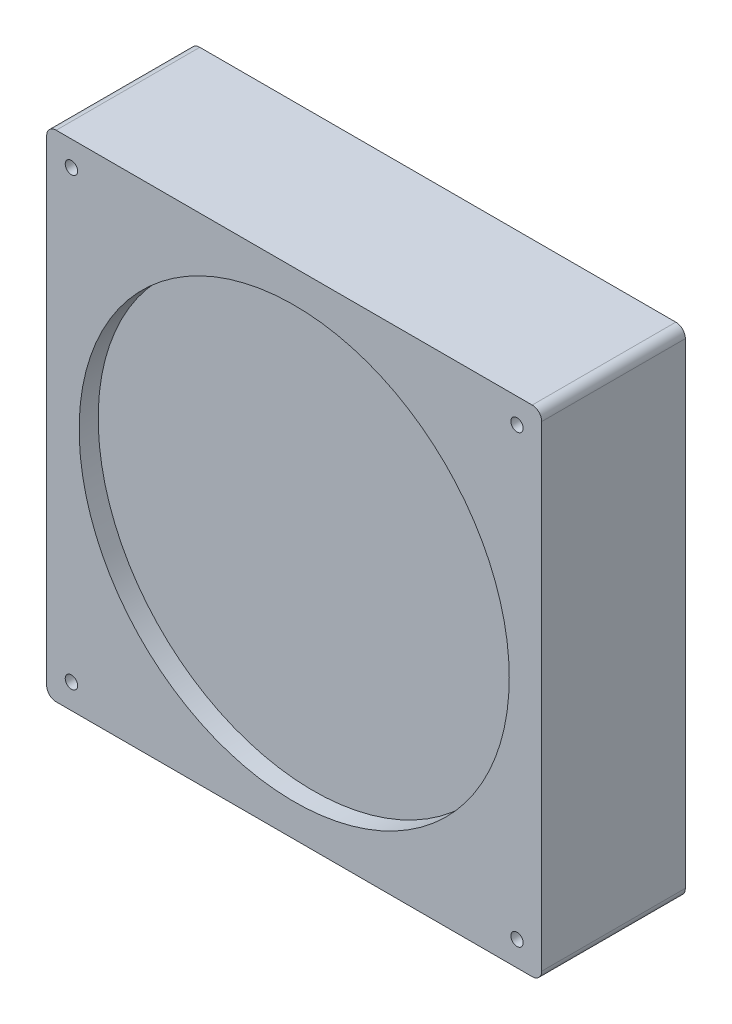
ISO-10303-21;
HEADER;
FILE_DESCRIPTION(('STEP AP214'),'2;1');
FILE_NAME('part.step','',(''),(''),'','','');
FILE_SCHEMA(('AUTOMOTIVE_DESIGN { 1 0 10303 214 1 1 1 1 }'));
ENDSEC;
DATA;
#1=APPLICATION_CONTEXT('core data for automotive mechanical design processes');
#2=APPLICATION_PROTOCOL_DEFINITION('international standard','automotive_design',2000,#1);
#3=PRODUCT_CONTEXT('',#1,'mechanical');
#4=PRODUCT('Part','Part','',(#3));
#5=PRODUCT_RELATED_PRODUCT_CATEGORY('part','',(#4));
#6=PRODUCT_DEFINITION_FORMATION('','',#4);
#7=PRODUCT_DEFINITION_CONTEXT('part definition',#1,'design');
#8=PRODUCT_DEFINITION('design','',#6,#7);
#9=PRODUCT_DEFINITION_SHAPE('','',#8);
#10=(LENGTH_UNIT() NAMED_UNIT(*) SI_UNIT(.MILLI.,.METRE.));
#11=(NAMED_UNIT(*) PLANE_ANGLE_UNIT() SI_UNIT($,.RADIAN.));
#12=(NAMED_UNIT(*) SI_UNIT($,.STERADIAN.) SOLID_ANGLE_UNIT());
#13=UNCERTAINTY_MEASURE_WITH_UNIT(LENGTH_MEASURE(1.E-05),#10,'distance_accuracy_value','');
#14=(GEOMETRIC_REPRESENTATION_CONTEXT(3) GLOBAL_UNCERTAINTY_ASSIGNED_CONTEXT((#13)) GLOBAL_UNIT_ASSIGNED_CONTEXT((#10,
#11,#12)) REPRESENTATION_CONTEXT('',''));
#15=CARTESIAN_POINT('',(0.,0.,0.));
#16=DIRECTION('',(0.,0.,1.));
#17=DIRECTION('',(1.,0.,0.));
#18=AXIS2_PLACEMENT_3D('',#15,#16,#17);
#19=CARTESIAN_POINT('',(66.0000000000017,66.0000000000007,38.29));
#20=DIRECTION('',(-1.00000000000001,0.,0.));
#21=DIRECTION('',(0.,0.,1.));
#22=AXIS2_PLACEMENT_3D('',#19,#20,#21);
#23=PLANE('',#22);
#24=DIRECTION('',(0.,1.00000000000001,0.));
#25=VECTOR('',#24,1.);
#26=CARTESIAN_POINT('',(66.0000000000017,66.0000000000007,38.29));
#27=LINE('',#26,#25);
#28=CARTESIAN_POINT('',(66.0000000000017,-63.4600000000009,38.29));
#29=VERTEX_POINT('',#28);
#30=CARTESIAN_POINT('',(66.0000000000017,63.4600000000007,38.29));
#31=VERTEX_POINT('',#30);
#32=EDGE_CURVE('E130',#29,#31,#27,.T.);
#33=ORIENTED_EDGE('',*,*,#32,.F.);
#34=DIRECTION('',(0.,0.,-1.));
#35=VECTOR('',#34,1.);
#36=CARTESIAN_POINT('',(66.0000000000017,-63.4600000000009,38.29));
#37=LINE('',#36,#35);
#38=CARTESIAN_POINT('',(66.0000000000017,-63.4600000000009,0.));
#39=VERTEX_POINT('',#38);
#40=EDGE_CURVE('E114',#29,#39,#37,.T.);
#41=ORIENTED_EDGE('',*,*,#40,.T.);
#42=DIRECTION('',(0.,1.00000000000001,0.));
#43=VECTOR('',#42,1.);
#44=CARTESIAN_POINT('',(66.0000000000017,66.0000000000007,0.));
#45=LINE('',#44,#43);
#46=CARTESIAN_POINT('',(66.0000000000017,63.4600000000007,0.));
#47=VERTEX_POINT('',#46);
#48=EDGE_CURVE('E127',#39,#47,#45,.T.);
#49=ORIENTED_EDGE('',*,*,#48,.T.);
#50=DIRECTION('',(0.,0.,-1.));
#51=VECTOR('',#50,1.);
#52=CARTESIAN_POINT('',(66.0000000000017,63.4600000000007,38.29));
#53=LINE('',#52,#51);
#54=EDGE_CURVE('E133',#47,#31,#53,.F.);
#55=ORIENTED_EDGE('',*,*,#54,.T.);
#56=EDGE_LOOP('',(#33,#41,#49,#55));
#57=FACE_BOUND('',#56,.T.);
#58=ADVANCED_FACE('F42',(#57),#23,.F.);
#59=CARTESIAN_POINT('',(-66.0000000000001,66.0000000000004,38.29));
#60=DIRECTION('',(0.,-1.00000000000001,0.));
#61=DIRECTION('',(0.,0.,-1.));
#62=AXIS2_PLACEMENT_3D('',#59,#60,#61);
#63=PLANE('',#62);
#64=DIRECTION('',(-1.00000000000001,0.,0.));
#65=VECTOR('',#64,1.);
#66=CARTESIAN_POINT('',(-66.0000000000001,66.0000000000004,38.29));
#67=LINE('',#66,#65);
#68=CARTESIAN_POINT('',(63.4600000000017,66.0000000000007,38.29));
#69=VERTEX_POINT('',#68);
#70=CARTESIAN_POINT('',(-63.4600000000001,66.0000000000004,38.29));
#71=VERTEX_POINT('',#70);
#72=EDGE_CURVE('E195',#69,#71,#67,.T.);
#73=ORIENTED_EDGE('',*,*,#72,.F.);
#74=DIRECTION('',(0.,0.,-1.));
#75=VECTOR('',#74,1.);
#76=CARTESIAN_POINT('',(63.4600000000017,66.0000000000007,38.29));
#77=LINE('',#76,#75);
#78=CARTESIAN_POINT('',(63.4600000000017,66.0000000000007,0.));
#79=VERTEX_POINT('',#78);
#80=EDGE_CURVE('E11',#69,#79,#77,.T.);
#81=ORIENTED_EDGE('',*,*,#80,.T.);
#82=DIRECTION('',(-1.00000000000001,0.,0.));
#83=VECTOR('',#82,1.);
#84=CARTESIAN_POINT('',(-66.0000000000001,66.0000000000004,0.));
#85=LINE('',#84,#83);
#86=CARTESIAN_POINT('',(-63.4600000000001,66.0000000000004,0.));
#87=VERTEX_POINT('',#86);
#88=EDGE_CURVE('E139',#79,#87,#85,.T.);
#89=ORIENTED_EDGE('',*,*,#88,.T.);
#90=DIRECTION('',(0.,0.,-1.));
#91=VECTOR('',#90,1.);
#92=CARTESIAN_POINT('',(-63.4600000000001,66.0000000000004,38.29));
#93=LINE('',#92,#91);
#94=EDGE_CURVE('E51',#87,#71,#93,.F.);
#95=ORIENTED_EDGE('',*,*,#94,.T.);
#96=EDGE_LOOP('',(#73,#81,#89,#95));
#97=FACE_BOUND('',#96,.T.);
#98=ADVANCED_FACE('F194',(#97),#63,.F.);
#99=CARTESIAN_POINT('',(-66.0000000000001,66.0000000000004,38.29));
#100=DIRECTION('',(1.00000000000001,0.,0.));
#101=DIRECTION('',(0.,1.00000000000001,0.));
#102=AXIS2_PLACEMENT_3D('',#99,#100,#101);
#103=PLANE('',#102);
#104=DIRECTION('',(0.,-1.00000000000001,0.));
#105=VECTOR('',#104,1.);
#106=CARTESIAN_POINT('',(-66.0000000000001,66.0000000000004,0.));
#107=LINE('',#106,#105);
#108=CARTESIAN_POINT('',(-66.0000000000001,63.4600000000004,0.));
#109=VERTEX_POINT('',#108);
#110=CARTESIAN_POINT('',(-66.0000000000001,-63.4600000000009,0.));
#111=VERTEX_POINT('',#110);
#112=EDGE_CURVE('E145',#109,#111,#107,.T.);
#113=ORIENTED_EDGE('',*,*,#112,.T.);
#114=DIRECTION('',(0.,0.,-1.));
#115=VECTOR('',#114,1.);
#116=CARTESIAN_POINT('',(-66.0000000000001,-63.4600000000009,38.29));
#117=LINE('',#116,#115);
#118=CARTESIAN_POINT('',(-66.0000000000001,-63.4600000000009,38.29));
#119=VERTEX_POINT('',#118);
#120=EDGE_CURVE('E58',#111,#119,#117,.F.);
#121=ORIENTED_EDGE('',*,*,#120,.T.);
#122=DIRECTION('',(0.,-1.00000000000001,0.));
#123=VECTOR('',#122,1.);
#124=CARTESIAN_POINT('',(-66.0000000000001,66.0000000000004,38.29));
#125=LINE('',#124,#123);
#126=CARTESIAN_POINT('',(-66.0000000000001,63.4600000000004,38.29));
#127=VERTEX_POINT('',#126);
#128=EDGE_CURVE('E202',#127,#119,#125,.T.);
#129=ORIENTED_EDGE('',*,*,#128,.F.);
#130=DIRECTION('',(0.,0.,-1.));
#131=VECTOR('',#130,1.);
#132=CARTESIAN_POINT('',(-66.0000000000001,63.4600000000004,38.29));
#133=LINE('',#132,#131);
#134=EDGE_CURVE('E184',#127,#109,#133,.T.);
#135=ORIENTED_EDGE('',*,*,#134,.T.);
#136=EDGE_LOOP('',(#113,#121,#129,#135));
#137=FACE_BOUND('',#136,.T.);
#138=ADVANCED_FACE('F206',(#137),#103,.F.);
#139=CARTESIAN_POINT('',(-66.0000000000001,-66.0000000000009,38.29));
#140=DIRECTION('',(0.,1.00000000000001,0.));
#141=DIRECTION('',(0.,0.,1.));
#142=AXIS2_PLACEMENT_3D('',#139,#140,#141);
#143=PLANE('',#142);
#144=DIRECTION('',(1.00000000000001,0.,0.));
#145=VECTOR('',#144,1.);
#146=CARTESIAN_POINT('',(-66.0000000000001,-66.0000000000009,0.));
#147=LINE('',#146,#145);
#148=CARTESIAN_POINT('',(-63.4600000000001,-66.0000000000009,0.));
#149=VERTEX_POINT('',#148);
#150=CARTESIAN_POINT('',(63.4600000000017,-66.0000000000009,0.));
#151=VERTEX_POINT('',#150);
#152=EDGE_CURVE('E157',#149,#151,#147,.T.);
#153=ORIENTED_EDGE('',*,*,#152,.T.);
#154=DIRECTION('',(0.,0.,-1.));
#155=VECTOR('',#154,1.);
#156=CARTESIAN_POINT('',(63.4600000000017,-66.0000000000009,38.29));
#157=LINE('',#156,#155);
#158=CARTESIAN_POINT('',(63.4600000000017,-66.0000000000009,38.29));
#159=VERTEX_POINT('',#158);
#160=EDGE_CURVE('E115',#151,#159,#157,.F.);
#161=ORIENTED_EDGE('',*,*,#160,.T.);
#162=DIRECTION('',(1.00000000000001,0.,0.));
#163=VECTOR('',#162,1.);
#164=CARTESIAN_POINT('',(-66.0000000000001,-66.0000000000009,38.29));
#165=LINE('',#164,#163);
#166=CARTESIAN_POINT('',(-63.4600000000001,-66.0000000000009,38.29));
#167=VERTEX_POINT('',#166);
#168=EDGE_CURVE('E152',#167,#159,#165,.T.);
#169=ORIENTED_EDGE('',*,*,#168,.F.);
#170=DIRECTION('',(0.,0.,-1.));
#171=VECTOR('',#170,1.);
#172=CARTESIAN_POINT('',(-63.4600000000001,-66.0000000000009,38.29));
#173=LINE('',#172,#171);
#174=EDGE_CURVE('E121',#167,#149,#173,.T.);
#175=ORIENTED_EDGE('',*,*,#174,.T.);
#176=EDGE_LOOP('',(#153,#161,#169,#175));
#177=FACE_BOUND('',#176,.T.);
#178=ADVANCED_FACE('F213',(#177),#143,.F.);
#179=CARTESIAN_POINT('',(0.,0.,38.29));
#180=DIRECTION('',(0.,0.,1.));
#181=DIRECTION('',(1.00000000000001,0.,0.));
#182=AXIS2_PLACEMENT_3D('',#179,#180,#181);
#183=PLANE('',#182);
#184=CARTESIAN_POINT('',(0.,0.,38.29));
#185=DIRECTION('',(0.,0.,1.));
#186=DIRECTION('',(1.00000000000001,0.,0.));
#187=AXIS2_PLACEMENT_3D('',#184,#185,#186);
#188=CIRCLE('',#187,57.3415273789641);
#189=CARTESIAN_POINT('',(57.3415273789645,0.,38.29));
#190=VERTEX_POINT('',#189);
#191=EDGE_CURVE('E245',#190,#190,#188,.T.);
#192=ORIENTED_EDGE('',*,*,#191,.F.);
#193=EDGE_LOOP('',(#192));
#194=FACE_BOUND('',#193,.T.);
#195=CARTESIAN_POINT('',(-59.4,59.4000000000004,38.29));
#196=DIRECTION('',(0.,0.,1.));
#197=DIRECTION('',(1.00000000000001,0.,0.));
#198=AXIS2_PLACEMENT_3D('',#195,#196,#197);
#199=CIRCLE('',#198,1.65);
#200=CARTESIAN_POINT('',(-57.75,59.4000000000004,38.29));
#201=VERTEX_POINT('',#200);
#202=EDGE_CURVE('E240',#201,#201,#199,.T.);
#203=ORIENTED_EDGE('',*,*,#202,.F.);
#204=EDGE_LOOP('',(#203));
#205=FACE_BOUND('',#204,.T.);
#206=CARTESIAN_POINT('',(59.4000000000018,59.4000000000006,38.29));
#207=DIRECTION('',(0.,0.,1.));
#208=DIRECTION('',(1.00000000000001,0.,0.));
#209=AXIS2_PLACEMENT_3D('',#206,#207,#208);
#210=CIRCLE('',#209,1.65);
#211=CARTESIAN_POINT('',(61.0500000000018,59.4000000000006,38.29));
#212=VERTEX_POINT('',#211);
#213=EDGE_CURVE('E233',#212,#212,#210,.T.);
#214=ORIENTED_EDGE('',*,*,#213,.F.);
#215=EDGE_LOOP('',(#214));
#216=FACE_BOUND('',#215,.T.);
#217=CARTESIAN_POINT('',(59.4000000000018,-59.4000000000009,38.29));
#218=DIRECTION('',(0.,0.,1.));
#219=DIRECTION('',(1.00000000000001,0.,0.));
#220=AXIS2_PLACEMENT_3D('',#217,#218,#219);
#221=CIRCLE('',#220,1.65);
#222=CARTESIAN_POINT('',(61.0500000000018,-59.4000000000009,38.29));
#223=VERTEX_POINT('',#222);
#224=EDGE_CURVE('E225',#223,#223,#221,.T.);
#225=ORIENTED_EDGE('',*,*,#224,.F.);
#226=EDGE_LOOP('',(#225));
#227=FACE_BOUND('',#226,.T.);
#228=CARTESIAN_POINT('',(-59.4,-59.4000000000009,38.29));
#229=DIRECTION('',(0.,0.,1.));
#230=DIRECTION('',(1.00000000000001,0.,0.));
#231=AXIS2_PLACEMENT_3D('',#228,#229,#230);
#232=CIRCLE('',#231,1.65);
#233=CARTESIAN_POINT('',(-57.75,-59.4000000000009,38.29));
#234=VERTEX_POINT('',#233);
#235=EDGE_CURVE('E149',#234,#234,#232,.T.);
#236=ORIENTED_EDGE('',*,*,#235,.F.);
#237=EDGE_LOOP('',(#236));
#238=FACE_BOUND('',#237,.T.);
#239=ORIENTED_EDGE('',*,*,#168,.T.);
#240=CARTESIAN_POINT('',(63.4600000000017,-63.4600000000009,38.29));
#241=DIRECTION('',(0.,0.,1.));
#242=DIRECTION('',(1.00000000000001,0.,0.));
#243=AXIS2_PLACEMENT_3D('',#240,#241,#242);
#244=CIRCLE('',#243,2.54);
#245=EDGE_CURVE('E181',#159,#29,#244,.T.);
#246=ORIENTED_EDGE('',*,*,#245,.T.);
#247=ORIENTED_EDGE('',*,*,#32,.T.);
#248=CARTESIAN_POINT('',(63.4600000000017,63.4600000000007,38.29));
#249=DIRECTION('',(0.,0.,1.));
#250=DIRECTION('',(1.00000000000001,0.,0.));
#251=AXIS2_PLACEMENT_3D('',#248,#249,#250);
#252=CIRCLE('',#251,2.54);
#253=EDGE_CURVE('E175',#31,#69,#252,.T.);
#254=ORIENTED_EDGE('',*,*,#253,.T.);
#255=ORIENTED_EDGE('',*,*,#72,.T.);
#256=CARTESIAN_POINT('',(-63.4600000000001,63.4600000000004,38.29));
#257=DIRECTION('',(0.,0.,1.));
#258=DIRECTION('',(1.00000000000001,0.,0.));
#259=AXIS2_PLACEMENT_3D('',#256,#257,#258);
#260=CIRCLE('',#259,2.54);
#261=EDGE_CURVE('E65',#71,#127,#260,.T.);
#262=ORIENTED_EDGE('',*,*,#261,.T.);
#263=ORIENTED_EDGE('',*,*,#128,.T.);
#264=CARTESIAN_POINT('',(-63.4600000000001,-63.4600000000009,38.29));
#265=DIRECTION('',(0.,0.,1.));
#266=DIRECTION('',(1.00000000000001,0.,0.));
#267=AXIS2_PLACEMENT_3D('',#264,#265,#266);
#268=CIRCLE('',#267,2.54);
#269=EDGE_CURVE('E178',#119,#167,#268,.T.);
#270=ORIENTED_EDGE('',*,*,#269,.T.);
#271=EDGE_LOOP('',(#239,#246,#247,#254,#255,#262,#263,#270));
#272=FACE_BOUND('',#271,.T.);
#273=ADVANCED_FACE('F199',(#194,#205,#216,#227,#238,#272),#183,.T.);
#274=CARTESIAN_POINT('',(0.,0.,0.));
#275=DIRECTION('',(0.,0.,1.));
#276=DIRECTION('',(1.00000000000001,0.,0.));
#277=AXIS2_PLACEMENT_3D('',#274,#275,#276);
#278=PLANE('',#277);
#279=CARTESIAN_POINT('',(-59.4,59.4000000000004,0.));
#280=DIRECTION('',(0.,0.,1.));
#281=DIRECTION('',(1.00000000000001,0.,0.));
#282=AXIS2_PLACEMENT_3D('',#279,#280,#281);
#283=CIRCLE('',#282,1.64999999999987);
#284=CARTESIAN_POINT('',(-57.7500000000001,59.4000000000004,0.));
#285=VERTEX_POINT('',#284);
#286=EDGE_CURVE('E237',#285,#285,#283,.T.);
#287=ORIENTED_EDGE('',*,*,#286,.T.);
#288=EDGE_LOOP('',(#287));
#289=FACE_BOUND('',#288,.T.);
#290=CARTESIAN_POINT('',(59.4000000000018,59.4000000000006,0.));
#291=DIRECTION('',(0.,0.,1.));
#292=DIRECTION('',(1.00000000000001,0.,0.));
#293=AXIS2_PLACEMENT_3D('',#290,#291,#292);
#294=CIRCLE('',#293,1.64999999999987);
#295=CARTESIAN_POINT('',(61.0500000000017,59.4000000000006,0.));
#296=VERTEX_POINT('',#295);
#297=EDGE_CURVE('E229',#296,#296,#294,.T.);
#298=ORIENTED_EDGE('',*,*,#297,.T.);
#299=EDGE_LOOP('',(#298));
#300=FACE_BOUND('',#299,.T.);
#301=CARTESIAN_POINT('',(59.4000000000018,-59.4000000000009,0.));
#302=DIRECTION('',(0.,0.,1.));
#303=DIRECTION('',(1.00000000000001,0.,0.));
#304=AXIS2_PLACEMENT_3D('',#301,#302,#303);
#305=CIRCLE('',#304,1.64999999999987);
#306=CARTESIAN_POINT('',(61.0500000000017,-59.4000000000009,0.));
#307=VERTEX_POINT('',#306);
#308=EDGE_CURVE('E221',#307,#307,#305,.T.);
#309=ORIENTED_EDGE('',*,*,#308,.T.);
#310=EDGE_LOOP('',(#309));
#311=FACE_BOUND('',#310,.T.);
#312=CARTESIAN_POINT('',(-59.4,-59.4000000000009,0.));
#313=DIRECTION('',(0.,0.,1.));
#314=DIRECTION('',(1.00000000000001,0.,0.));
#315=AXIS2_PLACEMENT_3D('',#312,#313,#314);
#316=CIRCLE('',#315,1.64999999999987);
#317=CARTESIAN_POINT('',(-57.7500000000001,-59.4000000000009,0.));
#318=VERTEX_POINT('',#317);
#319=EDGE_CURVE('E140',#318,#318,#316,.T.);
#320=ORIENTED_EDGE('',*,*,#319,.T.);
#321=EDGE_LOOP('',(#320));
#322=FACE_BOUND('',#321,.T.);
#323=ORIENTED_EDGE('',*,*,#48,.F.);
#324=CARTESIAN_POINT('',(63.4600000000017,-63.4600000000009,0.));
#325=DIRECTION('',(0.,0.,1.));
#326=DIRECTION('',(1.00000000000001,0.,0.));
#327=AXIS2_PLACEMENT_3D('',#324,#325,#326);
#328=CIRCLE('',#327,2.54);
#329=EDGE_CURVE('E110',#39,#151,#328,.F.);
#330=ORIENTED_EDGE('',*,*,#329,.T.);
#331=ORIENTED_EDGE('',*,*,#152,.F.);
#332=CARTESIAN_POINT('',(-63.4600000000001,-63.4600000000009,0.));
#333=DIRECTION('',(0.,0.,1.));
#334=DIRECTION('',(1.00000000000001,0.,0.));
#335=AXIS2_PLACEMENT_3D('',#332,#333,#334);
#336=CIRCLE('',#335,2.54);
#337=EDGE_CURVE('E122',#149,#111,#336,.F.);
#338=ORIENTED_EDGE('',*,*,#337,.T.);
#339=ORIENTED_EDGE('',*,*,#112,.F.);
#340=CARTESIAN_POINT('',(-63.4600000000001,63.4600000000004,0.));
#341=DIRECTION('',(0.,0.,1.));
#342=DIRECTION('',(1.00000000000001,0.,0.));
#343=AXIS2_PLACEMENT_3D('',#340,#341,#342);
#344=CIRCLE('',#343,2.54);
#345=EDGE_CURVE('E132',#109,#87,#344,.F.);
#346=ORIENTED_EDGE('',*,*,#345,.T.);
#347=ORIENTED_EDGE('',*,*,#88,.F.);
#348=CARTESIAN_POINT('',(63.4600000000017,63.4600000000007,0.));
#349=DIRECTION('',(0.,0.,1.));
#350=DIRECTION('',(1.00000000000001,0.,0.));
#351=AXIS2_PLACEMENT_3D('',#348,#349,#350);
#352=CIRCLE('',#351,2.54);
#353=EDGE_CURVE('E137',#79,#47,#352,.F.);
#354=ORIENTED_EDGE('',*,*,#353,.T.);
#355=EDGE_LOOP('',(#323,#330,#331,#338,#339,#346,#347,#354));
#356=FACE_BOUND('',#355,.T.);
#357=ADVANCED_FACE('F135',(#289,#300,#311,#322,#356),#278,.F.);
#358=CARTESIAN_POINT('',(63.4600000000017,-63.4600000000009,38.29));
#359=DIRECTION('',(0.,0.,-1.));
#360=DIRECTION('',(-1.00000000000001,0.,0.));
#361=AXIS2_PLACEMENT_3D('',#358,#359,#360);
#362=CYLINDRICAL_SURFACE('',#361,2.54);
#363=ORIENTED_EDGE('',*,*,#245,.F.);
#364=ORIENTED_EDGE('',*,*,#160,.F.);
#365=ORIENTED_EDGE('',*,*,#329,.F.);
#366=ORIENTED_EDGE('',*,*,#40,.F.);
#367=EDGE_LOOP('',(#363,#364,#365,#366));
#368=FACE_BOUND('',#367,.T.);
#369=ADVANCED_FACE('F113',(#368),#362,.T.);
#370=CARTESIAN_POINT('',(-63.4600000000001,-63.4600000000009,38.29));
#371=DIRECTION('',(0.,0.,-1.));
#372=DIRECTION('',(-1.00000000000001,0.,0.));
#373=AXIS2_PLACEMENT_3D('',#370,#371,#372);
#374=CYLINDRICAL_SURFACE('',#373,2.54);
#375=ORIENTED_EDGE('',*,*,#269,.F.);
#376=ORIENTED_EDGE('',*,*,#120,.F.);
#377=ORIENTED_EDGE('',*,*,#337,.F.);
#378=ORIENTED_EDGE('',*,*,#174,.F.);
#379=EDGE_LOOP('',(#375,#376,#377,#378));
#380=FACE_BOUND('',#379,.T.);
#381=ADVANCED_FACE('F210',(#380),#374,.T.);
#382=CARTESIAN_POINT('',(63.4600000000017,63.4600000000007,38.29));
#383=DIRECTION('',(0.,0.,-1.));
#384=DIRECTION('',(-1.00000000000001,0.,0.));
#385=AXIS2_PLACEMENT_3D('',#382,#383,#384);
#386=CYLINDRICAL_SURFACE('',#385,2.54);
#387=ORIENTED_EDGE('',*,*,#253,.F.);
#388=ORIENTED_EDGE('',*,*,#54,.F.);
#389=ORIENTED_EDGE('',*,*,#353,.F.);
#390=ORIENTED_EDGE('',*,*,#80,.F.);
#391=EDGE_LOOP('',(#387,#388,#389,#390));
#392=FACE_BOUND('',#391,.T.);
#393=ADVANCED_FACE('F285',(#392),#386,.T.);
#394=CARTESIAN_POINT('',(-63.4600000000001,63.4600000000004,38.29));
#395=DIRECTION('',(0.,0.,-1.));
#396=DIRECTION('',(-1.00000000000001,0.,0.));
#397=AXIS2_PLACEMENT_3D('',#394,#395,#396);
#398=CYLINDRICAL_SURFACE('',#397,2.54);
#399=ORIENTED_EDGE('',*,*,#261,.F.);
#400=ORIENTED_EDGE('',*,*,#94,.F.);
#401=ORIENTED_EDGE('',*,*,#345,.F.);
#402=ORIENTED_EDGE('',*,*,#134,.F.);
#403=EDGE_LOOP('',(#399,#400,#401,#402));
#404=FACE_BOUND('',#403,.T.);
#405=ADVANCED_FACE('F44',(#404),#398,.T.);
#406=CARTESIAN_POINT('',(-59.4,-59.4000000000009,38.29));
#407=DIRECTION('',(0.,0.,1.));
#408=DIRECTION('',(1.00000000000001,0.,0.));
#409=AXIS2_PLACEMENT_3D('',#406,#407,#408);
#410=CYLINDRICAL_SURFACE('',#409,1.64999999999994);
#411=ORIENTED_EDGE('',*,*,#319,.F.);
#412=EDGE_LOOP('',(#411));
#413=FACE_BOUND('',#412,.T.);
#414=ORIENTED_EDGE('',*,*,#235,.T.);
#415=EDGE_LOOP('',(#414));
#416=FACE_BOUND('',#415,.T.);
#417=ADVANCED_FACE('F273',(#413,#416),#410,.F.);
#418=CARTESIAN_POINT('',(59.4000000000018,-59.4000000000009,38.29));
#419=DIRECTION('',(0.,0.,1.));
#420=DIRECTION('',(1.00000000000001,0.,0.));
#421=AXIS2_PLACEMENT_3D('',#418,#419,#420);
#422=CYLINDRICAL_SURFACE('',#421,1.64999999999994);
#423=ORIENTED_EDGE('',*,*,#308,.F.);
#424=EDGE_LOOP('',(#423));
#425=FACE_BOUND('',#424,.T.);
#426=ORIENTED_EDGE('',*,*,#224,.T.);
#427=EDGE_LOOP('',(#426));
#428=FACE_BOUND('',#427,.T.);
#429=ADVANCED_FACE('F275',(#425,#428),#422,.F.);
#430=CARTESIAN_POINT('',(59.4000000000018,59.4000000000006,38.29));
#431=DIRECTION('',(0.,0.,1.));
#432=DIRECTION('',(1.00000000000001,0.,0.));
#433=AXIS2_PLACEMENT_3D('',#430,#431,#432);
#434=CYLINDRICAL_SURFACE('',#433,1.64999999999994);
#435=ORIENTED_EDGE('',*,*,#297,.F.);
#436=EDGE_LOOP('',(#435));
#437=FACE_BOUND('',#436,.T.);
#438=ORIENTED_EDGE('',*,*,#213,.T.);
#439=EDGE_LOOP('',(#438));
#440=FACE_BOUND('',#439,.T.);
#441=ADVANCED_FACE('F282',(#437,#440),#434,.F.);
#442=CARTESIAN_POINT('',(-59.4,59.4000000000004,38.29));
#443=DIRECTION('',(0.,0.,1.));
#444=DIRECTION('',(1.00000000000001,0.,0.));
#445=AXIS2_PLACEMENT_3D('',#442,#443,#444);
#446=CYLINDRICAL_SURFACE('',#445,1.64999999999994);
#447=ORIENTED_EDGE('',*,*,#286,.F.);
#448=EDGE_LOOP('',(#447));
#449=FACE_BOUND('',#448,.T.);
#450=ORIENTED_EDGE('',*,*,#202,.T.);
#451=EDGE_LOOP('',(#450));
#452=FACE_BOUND('',#451,.T.);
#453=ADVANCED_FACE('F258',(#449,#452),#446,.F.);
#454=CARTESIAN_POINT('',(0.,0.,33.21));
#455=DIRECTION('',(0.,0.,1.));
#456=DIRECTION('',(1.00000000000001,0.,0.));
#457=AXIS2_PLACEMENT_3D('',#454,#455,#456);
#458=CYLINDRICAL_SURFACE('',#457,57.3415273789641);
#459=CARTESIAN_POINT('',(0.,0.,33.21));
#460=DIRECTION('',(0.,0.,1.));
#461=DIRECTION('',(1.00000000000001,0.,0.));
#462=AXIS2_PLACEMENT_3D('',#459,#460,#461);
#463=CIRCLE('',#462,57.3415273789641);
#464=CARTESIAN_POINT('',(57.3415273789645,0.,33.21));
#465=VERTEX_POINT('',#464);
#466=EDGE_CURVE('E244',#465,#465,#463,.T.);
#467=ORIENTED_EDGE('',*,*,#466,.F.);
#468=EDGE_LOOP('',(#467));
#469=FACE_BOUND('',#468,.T.);
#470=ORIENTED_EDGE('',*,*,#191,.T.);
#471=EDGE_LOOP('',(#470));
#472=FACE_BOUND('',#471,.T.);
#473=ADVANCED_FACE('F255',(#469,#472),#458,.F.);
#474=CARTESIAN_POINT('',(0.,0.,33.21));
#475=DIRECTION('',(0.,0.,1.));
#476=DIRECTION('',(1.00000000000001,0.,0.));
#477=AXIS2_PLACEMENT_3D('',#474,#475,#476);
#478=PLANE('',#477);
#479=ORIENTED_EDGE('',*,*,#466,.T.);
#480=EDGE_LOOP('',(#479));
#481=FACE_BOUND('',#480,.T.);
#482=ADVANCED_FACE('F253',(#481),#478,.T.);
#483=CLOSED_SHELL('',(#58,#98,#138,#178,#273,#357,#369,#381,#393,#405,#417,#429,#441,#453,#473,#482));
#484=MANIFOLD_SOLID_BREP('B2',#483);
#485=ADVANCED_BREP_SHAPE_REPRESENTATION('',(#18,#484),#14);
#486=SHAPE_DEFINITION_REPRESENTATION(#9,#485);
ENDSEC;
END-ISO-10303-21;
